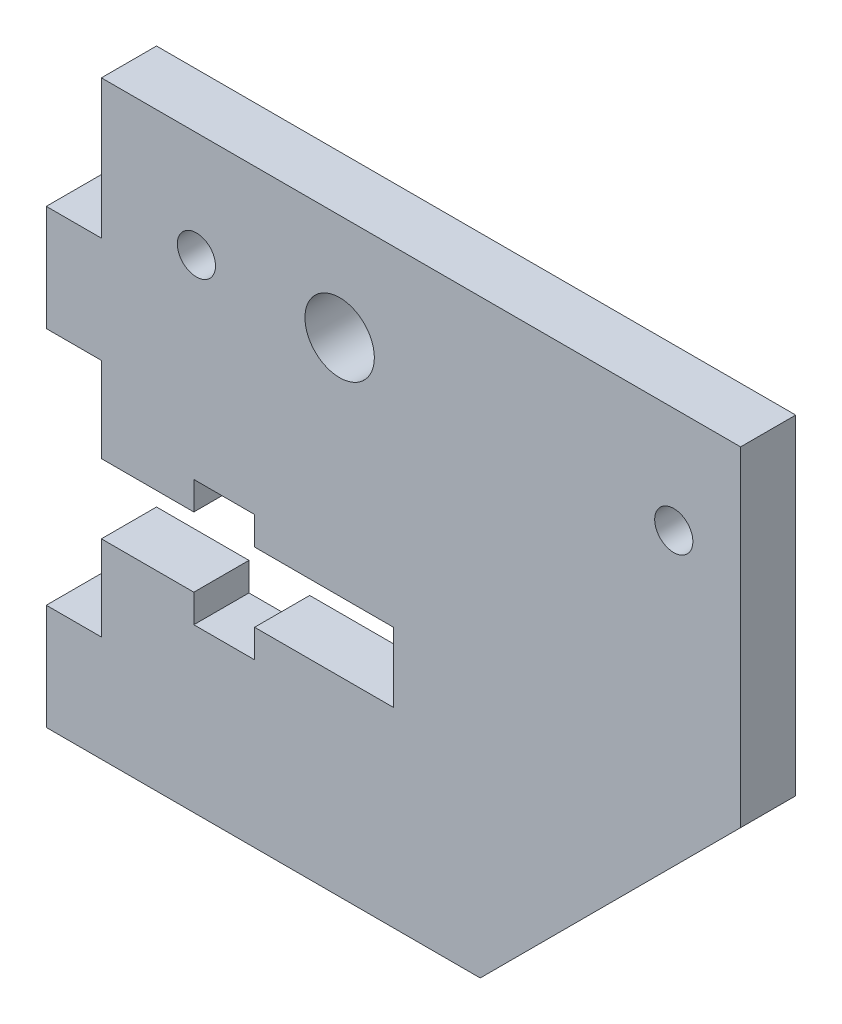
ISO-10303-21;
HEADER;
FILE_DESCRIPTION(('STEP AP214'),'2;1');
FILE_NAME('part.step','',(''),(''),'','','');
FILE_SCHEMA(('AUTOMOTIVE_DESIGN { 1 0 10303 214 1 1 1 1 }'));
ENDSEC;
DATA;
#1=APPLICATION_CONTEXT('core data for automotive mechanical design processes');
#2=APPLICATION_PROTOCOL_DEFINITION('international standard','automotive_design',2000,#1);
#3=PRODUCT_CONTEXT('',#1,'mechanical');
#4=PRODUCT('Part','Part','',(#3));
#5=PRODUCT_RELATED_PRODUCT_CATEGORY('part','',(#4));
#6=PRODUCT_DEFINITION_FORMATION('','',#4);
#7=PRODUCT_DEFINITION_CONTEXT('part definition',#1,'design');
#8=PRODUCT_DEFINITION('design','',#6,#7);
#9=PRODUCT_DEFINITION_SHAPE('','',#8);
#10=(LENGTH_UNIT() NAMED_UNIT(*) SI_UNIT(.MILLI.,.METRE.));
#11=(NAMED_UNIT(*) PLANE_ANGLE_UNIT() SI_UNIT($,.RADIAN.));
#12=(NAMED_UNIT(*) SI_UNIT($,.STERADIAN.) SOLID_ANGLE_UNIT());
#13=UNCERTAINTY_MEASURE_WITH_UNIT(LENGTH_MEASURE(1.E-05),#10,'distance_accuracy_value','');
#14=(GEOMETRIC_REPRESENTATION_CONTEXT(3) GLOBAL_UNCERTAINTY_ASSIGNED_CONTEXT((#13)) GLOBAL_UNIT_ASSIGNED_CONTEXT((#10,
#11,#12)) REPRESENTATION_CONTEXT('',''));
#15=CARTESIAN_POINT('',(0.,0.,0.));
#16=DIRECTION('',(0.,0.,1.));
#17=DIRECTION('',(1.,0.,0.));
#18=AXIS2_PLACEMENT_3D('',#15,#16,#17);
#19=CARTESIAN_POINT('',(0.,34.,3.175));
#20=DIRECTION('',(0.,1.,0.));
#21=DIRECTION('',(-1.,0.,0.));
#22=AXIS2_PLACEMENT_3D('',#19,#20,#21);
#23=PLANE('',#22);
#24=DIRECTION('',(1.,0.,0.));
#25=VECTOR('',#24,1.);
#26=CARTESIAN_POINT('',(0.,34.,0.));
#27=LINE('',#26,#25);
#28=CARTESIAN_POINT('',(3.175,34.,0.));
#29=VERTEX_POINT('',#28);
#30=CARTESIAN_POINT('',(40.,34.,0.));
#31=VERTEX_POINT('',#30);
#32=EDGE_CURVE('E195',#29,#31,#27,.T.);
#33=ORIENTED_EDGE('',*,*,#32,.F.);
#34=DIRECTION('',(0.,0.,-1.));
#35=VECTOR('',#34,1.);
#36=CARTESIAN_POINT('',(3.175,34.,3.175));
#37=LINE('',#36,#35);
#38=CARTESIAN_POINT('',(3.175,34.,3.175));
#39=VERTEX_POINT('',#38);
#40=EDGE_CURVE('E190',#39,#29,#37,.T.);
#41=ORIENTED_EDGE('',*,*,#40,.F.);
#42=DIRECTION('',(1.,0.,0.));
#43=VECTOR('',#42,1.);
#44=CARTESIAN_POINT('',(0.,34.,3.175));
#45=LINE('',#44,#43);
#46=CARTESIAN_POINT('',(40.,34.,3.175));
#47=VERTEX_POINT('',#46);
#48=EDGE_CURVE('E193',#39,#47,#45,.T.);
#49=ORIENTED_EDGE('',*,*,#48,.T.);
#50=DIRECTION('',(0.,0.,-1.));
#51=VECTOR('',#50,1.);
#52=CARTESIAN_POINT('',(40.,34.,3.175));
#53=LINE('',#52,#51);
#54=EDGE_CURVE('E274',#47,#31,#53,.T.);
#55=ORIENTED_EDGE('',*,*,#54,.T.);
#56=EDGE_LOOP('',(#33,#41,#49,#55));
#57=FACE_BOUND('',#56,.T.);
#58=ADVANCED_FACE('F35',(#57),#23,.T.);
#59=CARTESIAN_POINT('',(3.175,0.,3.175));
#60=DIRECTION('',(-1.,0.,0.));
#61=DIRECTION('',(0.,0.,1.));
#62=AXIS2_PLACEMENT_3D('',#59,#60,#61);
#63=PLANE('',#62);
#64=DIRECTION('',(0.,1.,0.));
#65=VECTOR('',#64,1.);
#66=CARTESIAN_POINT('',(3.175,0.,0.));
#67=LINE('',#66,#65);
#68=CARTESIAN_POINT('',(3.175,26.,0.));
#69=VERTEX_POINT('',#68);
#70=EDGE_CURVE('E276',#69,#29,#67,.T.);
#71=ORIENTED_EDGE('',*,*,#70,.F.);
#72=DIRECTION('',(0.,0.,-1.));
#73=VECTOR('',#72,1.);
#74=CARTESIAN_POINT('',(3.175,26.,3.175));
#75=LINE('',#74,#73);
#76=CARTESIAN_POINT('',(3.175,26.,3.175));
#77=VERTEX_POINT('',#76);
#78=EDGE_CURVE('E201',#77,#69,#75,.T.);
#79=ORIENTED_EDGE('',*,*,#78,.F.);
#80=DIRECTION('',(0.,1.,0.));
#81=VECTOR('',#80,1.);
#82=CARTESIAN_POINT('',(3.175,0.,3.175));
#83=LINE('',#82,#81);
#84=EDGE_CURVE('E208',#77,#39,#83,.T.);
#85=ORIENTED_EDGE('',*,*,#84,.T.);
#86=ORIENTED_EDGE('',*,*,#40,.T.);
#87=EDGE_LOOP('',(#71,#79,#85,#86));
#88=FACE_BOUND('',#87,.T.);
#89=ADVANCED_FACE('F215',(#88),#63,.T.);
#90=CARTESIAN_POINT('',(0.,26.,3.175));
#91=DIRECTION('',(0.,1.,0.));
#92=DIRECTION('',(0.,0.,1.));
#93=AXIS2_PLACEMENT_3D('',#90,#91,#92);
#94=PLANE('',#93);
#95=DIRECTION('',(1.,0.,0.));
#96=VECTOR('',#95,1.);
#97=CARTESIAN_POINT('',(0.,26.,0.));
#98=LINE('',#97,#96);
#99=CARTESIAN_POINT('',(0.,26.,0.));
#100=VERTEX_POINT('',#99);
#101=EDGE_CURVE('E278',#100,#69,#98,.T.);
#102=ORIENTED_EDGE('',*,*,#101,.F.);
#103=DIRECTION('',(0.,0.,-1.));
#104=VECTOR('',#103,1.);
#105=CARTESIAN_POINT('',(0.,26.,3.175));
#106=LINE('',#105,#104);
#107=CARTESIAN_POINT('',(0.,26.,3.175));
#108=VERTEX_POINT('',#107);
#109=EDGE_CURVE('E379',#108,#100,#106,.T.);
#110=ORIENTED_EDGE('',*,*,#109,.F.);
#111=DIRECTION('',(1.,0.,0.));
#112=VECTOR('',#111,1.);
#113=CARTESIAN_POINT('',(0.,26.,3.175));
#114=LINE('',#113,#112);
#115=EDGE_CURVE('E216',#108,#77,#114,.T.);
#116=ORIENTED_EDGE('',*,*,#115,.T.);
#117=ORIENTED_EDGE('',*,*,#78,.T.);
#118=EDGE_LOOP('',(#102,#110,#116,#117));
#119=FACE_BOUND('',#118,.T.);
#120=ADVANCED_FACE('F395',(#119),#94,.T.);
#121=CARTESIAN_POINT('',(0.,0.,3.175));
#122=DIRECTION('',(-1.,0.,0.));
#123=DIRECTION('',(0.,-1.,0.));
#124=AXIS2_PLACEMENT_3D('',#121,#122,#123);
#125=PLANE('',#124);
#126=DIRECTION('',(0.,1.,0.));
#127=VECTOR('',#126,1.);
#128=CARTESIAN_POINT('',(0.,0.,0.));
#129=LINE('',#128,#127);
#130=CARTESIAN_POINT('',(0.,19.9,0.));
#131=VERTEX_POINT('',#130);
#132=EDGE_CURVE('E281',#131,#100,#129,.T.);
#133=ORIENTED_EDGE('',*,*,#132,.F.);
#134=DIRECTION('',(0.,0.,-1.));
#135=VECTOR('',#134,1.);
#136=CARTESIAN_POINT('',(0.,19.9,3.175));
#137=LINE('',#136,#135);
#138=CARTESIAN_POINT('',(0.,19.9,3.175));
#139=VERTEX_POINT('',#138);
#140=EDGE_CURVE('E377',#139,#131,#137,.T.);
#141=ORIENTED_EDGE('',*,*,#140,.F.);
#142=DIRECTION('',(0.,1.,0.));
#143=VECTOR('',#142,1.);
#144=CARTESIAN_POINT('',(0.,0.,3.175));
#145=LINE('',#144,#143);
#146=EDGE_CURVE('E218',#139,#108,#145,.T.);
#147=ORIENTED_EDGE('',*,*,#146,.T.);
#148=ORIENTED_EDGE('',*,*,#109,.T.);
#149=EDGE_LOOP('',(#133,#141,#147,#148));
#150=FACE_BOUND('',#149,.T.);
#151=ADVANCED_FACE('F398',(#150),#125,.T.);
#152=CARTESIAN_POINT('',(0.,19.9,3.175));
#153=DIRECTION('',(0.,1.,0.));
#154=DIRECTION('',(0.,0.,1.));
#155=AXIS2_PLACEMENT_3D('',#152,#153,#154);
#156=PLANE('',#155);
#157=DIRECTION('',(1.,0.,0.));
#158=VECTOR('',#157,1.);
#159=CARTESIAN_POINT('',(0.,19.9,0.));
#160=LINE('',#159,#158);
#161=CARTESIAN_POINT('',(3.175,19.9,0.));
#162=VERTEX_POINT('',#161);
#163=EDGE_CURVE('E284',#131,#162,#160,.T.);
#164=ORIENTED_EDGE('',*,*,#163,.T.);
#165=DIRECTION('',(0.,0.,-1.));
#166=VECTOR('',#165,1.);
#167=CARTESIAN_POINT('',(3.175,19.9,3.175));
#168=LINE('',#167,#166);
#169=CARTESIAN_POINT('',(3.175,19.9,3.175));
#170=VERTEX_POINT('',#169);
#171=EDGE_CURVE('E374',#170,#162,#168,.T.);
#172=ORIENTED_EDGE('',*,*,#171,.F.);
#173=DIRECTION('',(1.,0.,0.));
#174=VECTOR('',#173,1.);
#175=CARTESIAN_POINT('',(0.,19.9,3.175));
#176=LINE('',#175,#174);
#177=EDGE_CURVE('E223',#139,#170,#176,.T.);
#178=ORIENTED_EDGE('',*,*,#177,.F.);
#179=ORIENTED_EDGE('',*,*,#140,.T.);
#180=EDGE_LOOP('',(#164,#172,#178,#179));
#181=FACE_BOUND('',#180,.T.);
#182=ADVANCED_FACE('F402',(#181),#156,.F.);
#183=CARTESIAN_POINT('',(3.175,0.,3.175));
#184=DIRECTION('',(1.,0.,0.));
#185=DIRECTION('',(0.,1.,0.));
#186=AXIS2_PLACEMENT_3D('',#183,#184,#185);
#187=PLANE('',#186);
#188=DIRECTION('',(0.,-1.,0.));
#189=VECTOR('',#188,1.);
#190=CARTESIAN_POINT('',(3.175,0.,0.));
#191=LINE('',#190,#189);
#192=CARTESIAN_POINT('',(3.175,15.,0.));
#193=VERTEX_POINT('',#192);
#194=EDGE_CURVE('E286',#162,#193,#191,.T.);
#195=ORIENTED_EDGE('',*,*,#194,.T.);
#196=DIRECTION('',(0.,0.,-1.));
#197=VECTOR('',#196,1.);
#198=CARTESIAN_POINT('',(3.175,15.,3.175));
#199=LINE('',#198,#197);
#200=CARTESIAN_POINT('',(3.175,15.,3.175));
#201=VERTEX_POINT('',#200);
#202=EDGE_CURVE('E371',#201,#193,#199,.T.);
#203=ORIENTED_EDGE('',*,*,#202,.F.);
#204=DIRECTION('',(0.,-1.,0.));
#205=VECTOR('',#204,1.);
#206=CARTESIAN_POINT('',(3.175,0.,3.175));
#207=LINE('',#206,#205);
#208=EDGE_CURVE('E225',#170,#201,#207,.T.);
#209=ORIENTED_EDGE('',*,*,#208,.F.);
#210=ORIENTED_EDGE('',*,*,#171,.T.);
#211=EDGE_LOOP('',(#195,#203,#209,#210));
#212=FACE_BOUND('',#211,.T.);
#213=ADVANCED_FACE('F409',(#212),#187,.F.);
#214=CARTESIAN_POINT('',(0.,15.,3.175));
#215=DIRECTION('',(0.,1.,0.));
#216=DIRECTION('',(0.,0.,1.));
#217=AXIS2_PLACEMENT_3D('',#214,#215,#216);
#218=PLANE('',#217);
#219=DIRECTION('',(1.,0.,0.));
#220=VECTOR('',#219,1.);
#221=CARTESIAN_POINT('',(0.,15.,0.));
#222=LINE('',#221,#220);
#223=CARTESIAN_POINT('',(8.5,15.,0.));
#224=VERTEX_POINT('',#223);
#225=EDGE_CURVE('E288',#193,#224,#222,.T.);
#226=ORIENTED_EDGE('',*,*,#225,.T.);
#227=DIRECTION('',(0.,0.,-1.));
#228=VECTOR('',#227,1.);
#229=CARTESIAN_POINT('',(8.5,15.,3.175));
#230=LINE('',#229,#228);
#231=CARTESIAN_POINT('',(8.5,15.,3.175));
#232=VERTEX_POINT('',#231);
#233=EDGE_CURVE('E369',#232,#224,#230,.T.);
#234=ORIENTED_EDGE('',*,*,#233,.F.);
#235=DIRECTION('',(1.,0.,0.));
#236=VECTOR('',#235,1.);
#237=CARTESIAN_POINT('',(0.,15.,3.175));
#238=LINE('',#237,#236);
#239=EDGE_CURVE('E227',#201,#232,#238,.T.);
#240=ORIENTED_EDGE('',*,*,#239,.F.);
#241=ORIENTED_EDGE('',*,*,#202,.T.);
#242=EDGE_LOOP('',(#226,#234,#240,#241));
#243=FACE_BOUND('',#242,.T.);
#244=ADVANCED_FACE('F413',(#243),#218,.F.);
#245=CARTESIAN_POINT('',(8.5,0.,3.175));
#246=DIRECTION('',(1.,0.,0.));
#247=DIRECTION('',(0.,0.,-1.));
#248=AXIS2_PLACEMENT_3D('',#245,#246,#247);
#249=PLANE('',#248);
#250=DIRECTION('',(0.,-1.,0.));
#251=VECTOR('',#250,1.);
#252=CARTESIAN_POINT('',(8.5,0.,0.));
#253=LINE('',#252,#251);
#254=CARTESIAN_POINT('',(8.5,16.625,0.));
#255=VERTEX_POINT('',#254);
#256=EDGE_CURVE('E291',#255,#224,#253,.T.);
#257=ORIENTED_EDGE('',*,*,#256,.F.);
#258=DIRECTION('',(0.,0.,-1.));
#259=VECTOR('',#258,1.);
#260=CARTESIAN_POINT('',(8.5,16.625,3.175));
#261=LINE('',#260,#259);
#262=CARTESIAN_POINT('',(8.5,16.625,3.175));
#263=VERTEX_POINT('',#262);
#264=EDGE_CURVE('E367',#263,#255,#261,.T.);
#265=ORIENTED_EDGE('',*,*,#264,.F.);
#266=DIRECTION('',(0.,-1.,0.));
#267=VECTOR('',#266,1.);
#268=CARTESIAN_POINT('',(8.5,0.,3.175));
#269=LINE('',#268,#267);
#270=EDGE_CURVE('E229',#263,#232,#269,.T.);
#271=ORIENTED_EDGE('',*,*,#270,.T.);
#272=ORIENTED_EDGE('',*,*,#233,.T.);
#273=EDGE_LOOP('',(#257,#265,#271,#272));
#274=FACE_BOUND('',#273,.T.);
#275=ADVANCED_FACE('F416',(#274),#249,.T.);
#276=CARTESIAN_POINT('',(0.,16.625,3.175));
#277=DIRECTION('',(0.,1.,0.));
#278=DIRECTION('',(0.,0.,1.));
#279=AXIS2_PLACEMENT_3D('',#276,#277,#278);
#280=PLANE('',#279);
#281=DIRECTION('',(1.,0.,0.));
#282=VECTOR('',#281,1.);
#283=CARTESIAN_POINT('',(0.,16.625,0.));
#284=LINE('',#283,#282);
#285=CARTESIAN_POINT('',(12.,16.625,0.));
#286=VERTEX_POINT('',#285);
#287=EDGE_CURVE('E294',#255,#286,#284,.T.);
#288=ORIENTED_EDGE('',*,*,#287,.T.);
#289=DIRECTION('',(0.,0.,-1.));
#290=VECTOR('',#289,1.);
#291=CARTESIAN_POINT('',(12.,16.625,3.175));
#292=LINE('',#291,#290);
#293=CARTESIAN_POINT('',(12.,16.625,3.175));
#294=VERTEX_POINT('',#293);
#295=EDGE_CURVE('E364',#294,#286,#292,.T.);
#296=ORIENTED_EDGE('',*,*,#295,.F.);
#297=DIRECTION('',(1.,0.,0.));
#298=VECTOR('',#297,1.);
#299=CARTESIAN_POINT('',(0.,16.625,3.175));
#300=LINE('',#299,#298);
#301=EDGE_CURVE('E232',#263,#294,#300,.T.);
#302=ORIENTED_EDGE('',*,*,#301,.F.);
#303=ORIENTED_EDGE('',*,*,#264,.T.);
#304=EDGE_LOOP('',(#288,#296,#302,#303));
#305=FACE_BOUND('',#304,.T.);
#306=ADVANCED_FACE('F422',(#305),#280,.F.);
#307=CARTESIAN_POINT('',(12.,0.,3.175));
#308=DIRECTION('',(1.,0.,0.));
#309=DIRECTION('',(0.,0.,-1.));
#310=AXIS2_PLACEMENT_3D('',#307,#308,#309);
#311=PLANE('',#310);
#312=DIRECTION('',(0.,-1.,0.));
#313=VECTOR('',#312,1.);
#314=CARTESIAN_POINT('',(12.,0.,0.));
#315=LINE('',#314,#313);
#316=CARTESIAN_POINT('',(12.,15.,0.));
#317=VERTEX_POINT('',#316);
#318=EDGE_CURVE('E296',#286,#317,#315,.T.);
#319=ORIENTED_EDGE('',*,*,#318,.T.);
#320=DIRECTION('',(0.,0.,-1.));
#321=VECTOR('',#320,1.);
#322=CARTESIAN_POINT('',(12.,15.,3.175));
#323=LINE('',#322,#321);
#324=CARTESIAN_POINT('',(12.,15.,3.175));
#325=VERTEX_POINT('',#324);
#326=EDGE_CURVE('E361',#325,#317,#323,.T.);
#327=ORIENTED_EDGE('',*,*,#326,.F.);
#328=DIRECTION('',(0.,-1.,0.));
#329=VECTOR('',#328,1.);
#330=CARTESIAN_POINT('',(12.,0.,3.175));
#331=LINE('',#330,#329);
#332=EDGE_CURVE('E234',#294,#325,#331,.T.);
#333=ORIENTED_EDGE('',*,*,#332,.F.);
#334=ORIENTED_EDGE('',*,*,#295,.T.);
#335=EDGE_LOOP('',(#319,#327,#333,#334));
#336=FACE_BOUND('',#335,.T.);
#337=ADVANCED_FACE('F426',(#336),#311,.F.);
#338=CARTESIAN_POINT('',(0.,15.,3.175));
#339=DIRECTION('',(0.,1.,0.));
#340=DIRECTION('',(0.,0.,1.));
#341=AXIS2_PLACEMENT_3D('',#338,#339,#340);
#342=PLANE('',#341);
#343=DIRECTION('',(1.,0.,0.));
#344=VECTOR('',#343,1.);
#345=CARTESIAN_POINT('',(0.,15.,0.));
#346=LINE('',#345,#344);
#347=CARTESIAN_POINT('',(20.,15.,0.));
#348=VERTEX_POINT('',#347);
#349=EDGE_CURVE('E298',#317,#348,#346,.T.);
#350=ORIENTED_EDGE('',*,*,#349,.T.);
#351=DIRECTION('',(0.,0.,-1.));
#352=VECTOR('',#351,1.);
#353=CARTESIAN_POINT('',(20.,15.,3.175));
#354=LINE('',#353,#352);
#355=CARTESIAN_POINT('',(20.,15.,3.175));
#356=VERTEX_POINT('',#355);
#357=EDGE_CURVE('E358',#356,#348,#354,.T.);
#358=ORIENTED_EDGE('',*,*,#357,.F.);
#359=DIRECTION('',(1.,0.,0.));
#360=VECTOR('',#359,1.);
#361=CARTESIAN_POINT('',(0.,15.,3.175));
#362=LINE('',#361,#360);
#363=EDGE_CURVE('E236',#325,#356,#362,.T.);
#364=ORIENTED_EDGE('',*,*,#363,.F.);
#365=ORIENTED_EDGE('',*,*,#326,.T.);
#366=EDGE_LOOP('',(#350,#358,#364,#365));
#367=FACE_BOUND('',#366,.T.);
#368=ADVANCED_FACE('F431',(#367),#342,.F.);
#369=CARTESIAN_POINT('',(20.,0.,3.175));
#370=DIRECTION('',(1.,0.,0.));
#371=DIRECTION('',(0.,0.,-1.));
#372=AXIS2_PLACEMENT_3D('',#369,#370,#371);
#373=PLANE('',#372);
#374=DIRECTION('',(0.,-1.,0.));
#375=VECTOR('',#374,1.);
#376=CARTESIAN_POINT('',(20.,0.,0.));
#377=LINE('',#376,#375);
#378=CARTESIAN_POINT('',(20.,11.,0.));
#379=VERTEX_POINT('',#378);
#380=EDGE_CURVE('E300',#348,#379,#377,.T.);
#381=ORIENTED_EDGE('',*,*,#380,.T.);
#382=DIRECTION('',(0.,0.,-1.));
#383=VECTOR('',#382,1.);
#384=CARTESIAN_POINT('',(20.,11.,3.175));
#385=LINE('',#384,#383);
#386=CARTESIAN_POINT('',(20.,11.,3.175));
#387=VERTEX_POINT('',#386);
#388=EDGE_CURVE('E356',#387,#379,#385,.T.);
#389=ORIENTED_EDGE('',*,*,#388,.F.);
#390=DIRECTION('',(0.,-1.,0.));
#391=VECTOR('',#390,1.);
#392=CARTESIAN_POINT('',(20.,0.,3.175));
#393=LINE('',#392,#391);
#394=EDGE_CURVE('E238',#356,#387,#393,.T.);
#395=ORIENTED_EDGE('',*,*,#394,.F.);
#396=ORIENTED_EDGE('',*,*,#357,.T.);
#397=EDGE_LOOP('',(#381,#389,#395,#396));
#398=FACE_BOUND('',#397,.T.);
#399=ADVANCED_FACE('F436',(#398),#373,.F.);
#400=CARTESIAN_POINT('',(0.,11.,3.175));
#401=DIRECTION('',(0.,1.,0.));
#402=DIRECTION('',(0.,0.,1.));
#403=AXIS2_PLACEMENT_3D('',#400,#401,#402);
#404=PLANE('',#403);
#405=DIRECTION('',(1.,0.,0.));
#406=VECTOR('',#405,1.);
#407=CARTESIAN_POINT('',(0.,11.,0.));
#408=LINE('',#407,#406);
#409=CARTESIAN_POINT('',(12.,11.,0.));
#410=VERTEX_POINT('',#409);
#411=EDGE_CURVE('E303',#410,#379,#408,.T.);
#412=ORIENTED_EDGE('',*,*,#411,.F.);
#413=DIRECTION('',(0.,0.,-1.));
#414=VECTOR('',#413,1.);
#415=CARTESIAN_POINT('',(12.,11.,3.175));
#416=LINE('',#415,#414);
#417=CARTESIAN_POINT('',(12.,11.,3.175));
#418=VERTEX_POINT('',#417);
#419=EDGE_CURVE('E354',#418,#410,#416,.T.);
#420=ORIENTED_EDGE('',*,*,#419,.F.);
#421=DIRECTION('',(1.,0.,0.));
#422=VECTOR('',#421,1.);
#423=CARTESIAN_POINT('',(0.,11.,3.175));
#424=LINE('',#423,#422);
#425=EDGE_CURVE('E240',#418,#387,#424,.T.);
#426=ORIENTED_EDGE('',*,*,#425,.T.);
#427=ORIENTED_EDGE('',*,*,#388,.T.);
#428=EDGE_LOOP('',(#412,#420,#426,#427));
#429=FACE_BOUND('',#428,.T.);
#430=ADVANCED_FACE('F440',(#429),#404,.T.);
#431=CARTESIAN_POINT('',(12.,0.,3.175));
#432=DIRECTION('',(1.,0.,0.));
#433=DIRECTION('',(0.,0.,-1.));
#434=AXIS2_PLACEMENT_3D('',#431,#432,#433);
#435=PLANE('',#434);
#436=DIRECTION('',(0.,-1.,0.));
#437=VECTOR('',#436,1.);
#438=CARTESIAN_POINT('',(12.,0.,0.));
#439=LINE('',#438,#437);
#440=CARTESIAN_POINT('',(12.,9.375,0.));
#441=VERTEX_POINT('',#440);
#442=EDGE_CURVE('E306',#410,#441,#439,.T.);
#443=ORIENTED_EDGE('',*,*,#442,.T.);
#444=DIRECTION('',(0.,0.,-1.));
#445=VECTOR('',#444,1.);
#446=CARTESIAN_POINT('',(12.,9.375,3.175));
#447=LINE('',#446,#445);
#448=CARTESIAN_POINT('',(12.,9.375,3.175));
#449=VERTEX_POINT('',#448);
#450=EDGE_CURVE('E352',#449,#441,#447,.T.);
#451=ORIENTED_EDGE('',*,*,#450,.F.);
#452=DIRECTION('',(0.,-1.,0.));
#453=VECTOR('',#452,1.);
#454=CARTESIAN_POINT('',(12.,0.,3.175));
#455=LINE('',#454,#453);
#456=EDGE_CURVE('E243',#418,#449,#455,.T.);
#457=ORIENTED_EDGE('',*,*,#456,.F.);
#458=ORIENTED_EDGE('',*,*,#419,.T.);
#459=EDGE_LOOP('',(#443,#451,#457,#458));
#460=FACE_BOUND('',#459,.T.);
#461=ADVANCED_FACE('F445',(#460),#435,.F.);
#462=CARTESIAN_POINT('',(0.,9.375,3.175));
#463=DIRECTION('',(0.,1.,0.));
#464=DIRECTION('',(0.,0.,1.));
#465=AXIS2_PLACEMENT_3D('',#462,#463,#464);
#466=PLANE('',#465);
#467=DIRECTION('',(1.,0.,0.));
#468=VECTOR('',#467,1.);
#469=CARTESIAN_POINT('',(0.,9.375,0.));
#470=LINE('',#469,#468);
#471=CARTESIAN_POINT('',(8.5,9.375,0.));
#472=VERTEX_POINT('',#471);
#473=EDGE_CURVE('E309',#472,#441,#470,.T.);
#474=ORIENTED_EDGE('',*,*,#473,.F.);
#475=DIRECTION('',(0.,0.,-1.));
#476=VECTOR('',#475,1.);
#477=CARTESIAN_POINT('',(8.5,9.375,3.175));
#478=LINE('',#477,#476);
#479=CARTESIAN_POINT('',(8.5,9.375,3.175));
#480=VERTEX_POINT('',#479);
#481=EDGE_CURVE('E350',#480,#472,#478,.T.);
#482=ORIENTED_EDGE('',*,*,#481,.F.);
#483=DIRECTION('',(1.,0.,0.));
#484=VECTOR('',#483,1.);
#485=CARTESIAN_POINT('',(0.,9.375,3.175));
#486=LINE('',#485,#484);
#487=EDGE_CURVE('E245',#480,#449,#486,.T.);
#488=ORIENTED_EDGE('',*,*,#487,.T.);
#489=ORIENTED_EDGE('',*,*,#450,.T.);
#490=EDGE_LOOP('',(#474,#482,#488,#489));
#491=FACE_BOUND('',#490,.T.);
#492=ADVANCED_FACE('F505',(#491),#466,.T.);
#493=CARTESIAN_POINT('',(8.5,0.,3.175));
#494=DIRECTION('',(1.,0.,0.));
#495=DIRECTION('',(0.,0.,-1.));
#496=AXIS2_PLACEMENT_3D('',#493,#494,#495);
#497=PLANE('',#496);
#498=DIRECTION('',(0.,-1.,0.));
#499=VECTOR('',#498,1.);
#500=CARTESIAN_POINT('',(8.5,0.,0.));
#501=LINE('',#500,#499);
#502=CARTESIAN_POINT('',(8.5,11.,0.));
#503=VERTEX_POINT('',#502);
#504=EDGE_CURVE('E312',#503,#472,#501,.T.);
#505=ORIENTED_EDGE('',*,*,#504,.F.);
#506=DIRECTION('',(0.,0.,-1.));
#507=VECTOR('',#506,1.);
#508=CARTESIAN_POINT('',(8.5,11.,3.175));
#509=LINE('',#508,#507);
#510=CARTESIAN_POINT('',(8.5,11.,3.175));
#511=VERTEX_POINT('',#510);
#512=EDGE_CURVE('E348',#511,#503,#509,.T.);
#513=ORIENTED_EDGE('',*,*,#512,.F.);
#514=DIRECTION('',(0.,-1.,0.));
#515=VECTOR('',#514,1.);
#516=CARTESIAN_POINT('',(8.5,0.,3.175));
#517=LINE('',#516,#515);
#518=EDGE_CURVE('E248',#511,#480,#517,.T.);
#519=ORIENTED_EDGE('',*,*,#518,.T.);
#520=ORIENTED_EDGE('',*,*,#481,.T.);
#521=EDGE_LOOP('',(#505,#513,#519,#520));
#522=FACE_BOUND('',#521,.T.);
#523=ADVANCED_FACE('F452',(#522),#497,.T.);
#524=CARTESIAN_POINT('',(0.,11.,3.175));
#525=DIRECTION('',(0.,1.,0.));
#526=DIRECTION('',(0.,0.,1.));
#527=AXIS2_PLACEMENT_3D('',#524,#525,#526);
#528=PLANE('',#527);
#529=DIRECTION('',(1.,0.,0.));
#530=VECTOR('',#529,1.);
#531=CARTESIAN_POINT('',(0.,11.,0.));
#532=LINE('',#531,#530);
#533=CARTESIAN_POINT('',(3.175,11.,0.));
#534=VERTEX_POINT('',#533);
#535=EDGE_CURVE('E315',#534,#503,#532,.T.);
#536=ORIENTED_EDGE('',*,*,#535,.F.);
#537=DIRECTION('',(0.,0.,-1.));
#538=VECTOR('',#537,1.);
#539=CARTESIAN_POINT('',(3.175,11.,3.175));
#540=LINE('',#539,#538);
#541=CARTESIAN_POINT('',(3.175,11.,3.175));
#542=VERTEX_POINT('',#541);
#543=EDGE_CURVE('E346',#542,#534,#540,.T.);
#544=ORIENTED_EDGE('',*,*,#543,.F.);
#545=DIRECTION('',(1.,0.,0.));
#546=VECTOR('',#545,1.);
#547=CARTESIAN_POINT('',(0.,11.,3.175));
#548=LINE('',#547,#546);
#549=EDGE_CURVE('E251',#542,#511,#548,.T.);
#550=ORIENTED_EDGE('',*,*,#549,.T.);
#551=ORIENTED_EDGE('',*,*,#512,.T.);
#552=EDGE_LOOP('',(#536,#544,#550,#551));
#553=FACE_BOUND('',#552,.T.);
#554=ADVANCED_FACE('F456',(#553),#528,.T.);
#555=CARTESIAN_POINT('',(3.175,0.,3.175));
#556=DIRECTION('',(1.,0.,0.));
#557=DIRECTION('',(0.,1.,0.));
#558=AXIS2_PLACEMENT_3D('',#555,#556,#557);
#559=PLANE('',#558);
#560=DIRECTION('',(0.,-1.,0.));
#561=VECTOR('',#560,1.);
#562=CARTESIAN_POINT('',(3.175,0.,0.));
#563=LINE('',#562,#561);
#564=CARTESIAN_POINT('',(3.175,6.1,0.));
#565=VERTEX_POINT('',#564);
#566=EDGE_CURVE('E318',#534,#565,#563,.T.);
#567=ORIENTED_EDGE('',*,*,#566,.T.);
#568=DIRECTION('',(0.,0.,-1.));
#569=VECTOR('',#568,1.);
#570=CARTESIAN_POINT('',(3.175,6.1,3.175));
#571=LINE('',#570,#569);
#572=CARTESIAN_POINT('',(3.175,6.1,3.175));
#573=VERTEX_POINT('',#572);
#574=EDGE_CURVE('E344',#573,#565,#571,.T.);
#575=ORIENTED_EDGE('',*,*,#574,.F.);
#576=DIRECTION('',(0.,-1.,0.));
#577=VECTOR('',#576,1.);
#578=CARTESIAN_POINT('',(3.175,0.,3.175));
#579=LINE('',#578,#577);
#580=EDGE_CURVE('E254',#542,#573,#579,.T.);
#581=ORIENTED_EDGE('',*,*,#580,.F.);
#582=ORIENTED_EDGE('',*,*,#543,.T.);
#583=EDGE_LOOP('',(#567,#575,#581,#582));
#584=FACE_BOUND('',#583,.T.);
#585=ADVANCED_FACE('F462',(#584),#559,.F.);
#586=CARTESIAN_POINT('',(0.,6.1,3.175));
#587=DIRECTION('',(0.,1.,0.));
#588=DIRECTION('',(0.,0.,1.));
#589=AXIS2_PLACEMENT_3D('',#586,#587,#588);
#590=PLANE('',#589);
#591=DIRECTION('',(1.,0.,0.));
#592=VECTOR('',#591,1.);
#593=CARTESIAN_POINT('',(0.,6.1,0.));
#594=LINE('',#593,#592);
#595=CARTESIAN_POINT('',(0.,6.1,0.));
#596=VERTEX_POINT('',#595);
#597=EDGE_CURVE('E321',#596,#565,#594,.T.);
#598=ORIENTED_EDGE('',*,*,#597,.F.);
#599=DIRECTION('',(0.,0.,-1.));
#600=VECTOR('',#599,1.);
#601=CARTESIAN_POINT('',(0.,6.1,3.175));
#602=LINE('',#601,#600);
#603=CARTESIAN_POINT('',(0.,6.1,3.175));
#604=VERTEX_POINT('',#603);
#605=EDGE_CURVE('E342',#604,#596,#602,.T.);
#606=ORIENTED_EDGE('',*,*,#605,.F.);
#607=DIRECTION('',(1.,0.,0.));
#608=VECTOR('',#607,1.);
#609=CARTESIAN_POINT('',(0.,6.1,3.175));
#610=LINE('',#609,#608);
#611=EDGE_CURVE('E256',#604,#573,#610,.T.);
#612=ORIENTED_EDGE('',*,*,#611,.T.);
#613=ORIENTED_EDGE('',*,*,#574,.T.);
#614=EDGE_LOOP('',(#598,#606,#612,#613));
#615=FACE_BOUND('',#614,.T.);
#616=ADVANCED_FACE('F466',(#615),#590,.T.);
#617=CARTESIAN_POINT('',(0.,0.,3.175));
#618=DIRECTION('',(-1.,0.,0.));
#619=DIRECTION('',(0.,-1.,0.));
#620=AXIS2_PLACEMENT_3D('',#617,#618,#619);
#621=PLANE('',#620);
#622=DIRECTION('',(0.,1.,0.));
#623=VECTOR('',#622,1.);
#624=CARTESIAN_POINT('',(0.,0.,0.));
#625=LINE('',#624,#623);
#626=CARTESIAN_POINT('',(0.,0.,0.));
#627=VERTEX_POINT('',#626);
#628=EDGE_CURVE('E324',#627,#596,#625,.T.);
#629=ORIENTED_EDGE('',*,*,#628,.F.);
#630=DIRECTION('',(0.,0.,-1.));
#631=VECTOR('',#630,1.);
#632=CARTESIAN_POINT('',(0.,0.,3.175));
#633=LINE('',#632,#631);
#634=CARTESIAN_POINT('',(0.,0.,3.175));
#635=VERTEX_POINT('',#634);
#636=EDGE_CURVE('E340',#635,#627,#633,.T.);
#637=ORIENTED_EDGE('',*,*,#636,.F.);
#638=DIRECTION('',(0.,1.,0.));
#639=VECTOR('',#638,1.);
#640=CARTESIAN_POINT('',(0.,0.,3.175));
#641=LINE('',#640,#639);
#642=EDGE_CURVE('E259',#635,#604,#641,.T.);
#643=ORIENTED_EDGE('',*,*,#642,.T.);
#644=ORIENTED_EDGE('',*,*,#605,.T.);
#645=EDGE_LOOP('',(#629,#637,#643,#644));
#646=FACE_BOUND('',#645,.T.);
#647=ADVANCED_FACE('F469',(#646),#621,.T.);
#648=CARTESIAN_POINT('',(0.,0.,3.175));
#649=DIRECTION('',(0.,1.,0.));
#650=DIRECTION('',(-1.,0.,0.));
#651=AXIS2_PLACEMENT_3D('',#648,#649,#650);
#652=PLANE('',#651);
#653=DIRECTION('',(1.,0.,0.));
#654=VECTOR('',#653,1.);
#655=CARTESIAN_POINT('',(0.,0.,0.));
#656=LINE('',#655,#654);
#657=CARTESIAN_POINT('',(25.,0.,0.));
#658=VERTEX_POINT('',#657);
#659=EDGE_CURVE('E327',#627,#658,#656,.T.);
#660=ORIENTED_EDGE('',*,*,#659,.T.);
#661=DIRECTION('',(0.,0.,1.));
#662=VECTOR('',#661,1.);
#663=CARTESIAN_POINT('',(25.,0.,3.175));
#664=LINE('',#663,#662);
#665=CARTESIAN_POINT('',(25.,0.,3.175));
#666=VERTEX_POINT('',#665);
#667=EDGE_CURVE('E43',#658,#666,#664,.T.);
#668=ORIENTED_EDGE('',*,*,#667,.T.);
#669=DIRECTION('',(1.,0.,0.));
#670=VECTOR('',#669,1.);
#671=CARTESIAN_POINT('',(0.,0.,3.175));
#672=LINE('',#671,#670);
#673=EDGE_CURVE('E262',#635,#666,#672,.T.);
#674=ORIENTED_EDGE('',*,*,#673,.F.);
#675=ORIENTED_EDGE('',*,*,#636,.T.);
#676=EDGE_LOOP('',(#660,#668,#674,#675));
#677=FACE_BOUND('',#676,.T.);
#678=ADVANCED_FACE('F518',(#677),#652,.F.);
#679=CARTESIAN_POINT('',(36.15,27.9,3.175));
#680=DIRECTION('',(0.,0.,-1.));
#681=DIRECTION('',(-1.,0.,0.));
#682=AXIS2_PLACEMENT_3D('',#679,#680,#681);
#683=CYLINDRICAL_SURFACE('',#682,1.10000000000001);
#684=CARTESIAN_POINT('',(36.15,27.9,3.175));
#685=DIRECTION('',(0.,0.,1.));
#686=DIRECTION('',(1.,0.,0.));
#687=AXIS2_PLACEMENT_3D('',#684,#685,#686);
#688=CIRCLE('',#687,1.10000000000001);
#689=CARTESIAN_POINT('',(37.25,27.9,3.175));
#690=VERTEX_POINT('',#689);
#691=EDGE_CURVE('E268',#690,#690,#688,.T.);
#692=ORIENTED_EDGE('',*,*,#691,.T.);
#693=EDGE_LOOP('',(#692));
#694=FACE_BOUND('',#693,.T.);
#695=CARTESIAN_POINT('',(36.15,27.9,0.));
#696=DIRECTION('',(0.,0.,1.));
#697=DIRECTION('',(1.,0.,0.));
#698=AXIS2_PLACEMENT_3D('',#695,#696,#697);
#699=CIRCLE('',#698,1.10000000000001);
#700=CARTESIAN_POINT('',(37.25,27.9,0.));
#701=VERTEX_POINT('',#700);
#702=EDGE_CURVE('E334',#701,#701,#699,.T.);
#703=ORIENTED_EDGE('',*,*,#702,.F.);
#704=EDGE_LOOP('',(#703));
#705=FACE_BOUND('',#704,.T.);
#706=ADVANCED_FACE('F521',(#694,#705),#683,.F.);
#707=CARTESIAN_POINT('',(8.65,27.9,3.175));
#708=DIRECTION('',(0.,0.,-1.));
#709=DIRECTION('',(-1.,0.,0.));
#710=AXIS2_PLACEMENT_3D('',#707,#708,#709);
#711=CYLINDRICAL_SURFACE('',#710,1.1);
#712=CARTESIAN_POINT('',(8.65,27.9,3.175));
#713=DIRECTION('',(0.,0.,1.));
#714=DIRECTION('',(1.,0.,0.));
#715=AXIS2_PLACEMENT_3D('',#712,#713,#714);
#716=CIRCLE('',#715,1.1);
#717=CARTESIAN_POINT('',(9.75,27.9,3.175));
#718=VERTEX_POINT('',#717);
#719=EDGE_CURVE('E265',#718,#718,#716,.T.);
#720=ORIENTED_EDGE('',*,*,#719,.T.);
#721=EDGE_LOOP('',(#720));
#722=FACE_BOUND('',#721,.T.);
#723=CARTESIAN_POINT('',(8.65,27.9,0.));
#724=DIRECTION('',(0.,0.,1.));
#725=DIRECTION('',(1.,0.,0.));
#726=AXIS2_PLACEMENT_3D('',#723,#724,#725);
#727=CIRCLE('',#726,1.1);
#728=CARTESIAN_POINT('',(9.75,27.9,0.));
#729=VERTEX_POINT('',#728);
#730=EDGE_CURVE('E331',#729,#729,#727,.T.);
#731=ORIENTED_EDGE('',*,*,#730,.F.);
#732=EDGE_LOOP('',(#731));
#733=FACE_BOUND('',#732,.T.);
#734=ADVANCED_FACE('F525',(#722,#733),#711,.F.);
#735=CARTESIAN_POINT('',(40.,0.,3.175));
#736=DIRECTION('',(-1.,0.,0.));
#737=DIRECTION('',(0.,0.,1.));
#738=AXIS2_PLACEMENT_3D('',#735,#736,#737);
#739=PLANE('',#738);
#740=DIRECTION('',(0.,1.,0.));
#741=VECTOR('',#740,1.);
#742=CARTESIAN_POINT('',(40.,0.,3.175));
#743=LINE('',#742,#741);
#744=CARTESIAN_POINT('',(40.,15.,3.175));
#745=VERTEX_POINT('',#744);
#746=EDGE_CURVE('E211',#745,#47,#743,.T.);
#747=ORIENTED_EDGE('',*,*,#746,.F.);
#748=DIRECTION('',(0.,0.,-1.));
#749=VECTOR('',#748,1.);
#750=CARTESIAN_POINT('',(40.,15.,3.175));
#751=LINE('',#750,#749);
#752=CARTESIAN_POINT('',(40.,15.,0.));
#753=VERTEX_POINT('',#752);
#754=EDGE_CURVE('E200',#745,#753,#751,.T.);
#755=ORIENTED_EDGE('',*,*,#754,.T.);
#756=DIRECTION('',(0.,1.,0.));
#757=VECTOR('',#756,1.);
#758=CARTESIAN_POINT('',(40.,0.,0.));
#759=LINE('',#758,#757);
#760=EDGE_CURVE('E329',#753,#31,#759,.T.);
#761=ORIENTED_EDGE('',*,*,#760,.T.);
#762=ORIENTED_EDGE('',*,*,#54,.F.);
#763=EDGE_LOOP('',(#747,#755,#761,#762));
#764=FACE_BOUND('',#763,.T.);
#765=ADVANCED_FACE('F386',(#764),#739,.F.);
#766=CARTESIAN_POINT('',(16.9,27.9,3.175));
#767=DIRECTION('',(0.,0.,-1.));
#768=DIRECTION('',(-1.,0.,0.));
#769=AXIS2_PLACEMENT_3D('',#766,#767,#768);
#770=CYLINDRICAL_SURFACE('',#769,2.);
#771=CARTESIAN_POINT('',(16.9,27.9,3.175));
#772=DIRECTION('',(0.,0.,1.));
#773=DIRECTION('',(1.,0.,0.));
#774=AXIS2_PLACEMENT_3D('',#771,#772,#773);
#775=CIRCLE('',#774,2.);
#776=CARTESIAN_POINT('',(18.9,27.9,3.175));
#777=VERTEX_POINT('',#776);
#778=EDGE_CURVE('E271',#777,#777,#775,.T.);
#779=ORIENTED_EDGE('',*,*,#778,.T.);
#780=EDGE_LOOP('',(#779));
#781=FACE_BOUND('',#780,.T.);
#782=CARTESIAN_POINT('',(16.9,27.9,0.));
#783=DIRECTION('',(0.,0.,1.));
#784=DIRECTION('',(1.,0.,0.));
#785=AXIS2_PLACEMENT_3D('',#782,#783,#784);
#786=CIRCLE('',#785,2.);
#787=CARTESIAN_POINT('',(18.9,27.9,0.));
#788=VERTEX_POINT('',#787);
#789=EDGE_CURVE('E213',#788,#788,#786,.T.);
#790=ORIENTED_EDGE('',*,*,#789,.F.);
#791=EDGE_LOOP('',(#790));
#792=FACE_BOUND('',#791,.T.);
#793=ADVANCED_FACE('F524',(#781,#792),#770,.F.);
#794=CARTESIAN_POINT('',(0.,0.,3.175));
#795=DIRECTION('',(0.,0.,1.));
#796=DIRECTION('',(1.,0.,0.));
#797=AXIS2_PLACEMENT_3D('',#794,#795,#796);
#798=PLANE('',#797);
#799=ORIENTED_EDGE('',*,*,#673,.T.);
#800=DIRECTION('',(-0.707106781186549,-0.707106781186546,0.));
#801=VECTOR('',#800,1.);
#802=CARTESIAN_POINT('',(12.4999999999999,-12.5,3.175));
#803=LINE('',#802,#801);
#804=EDGE_CURVE('E11',#666,#745,#803,.F.);
#805=ORIENTED_EDGE('',*,*,#804,.T.);
#806=ORIENTED_EDGE('',*,*,#746,.T.);
#807=ORIENTED_EDGE('',*,*,#48,.F.);
#808=ORIENTED_EDGE('',*,*,#84,.F.);
#809=ORIENTED_EDGE('',*,*,#115,.F.);
#810=ORIENTED_EDGE('',*,*,#146,.F.);
#811=ORIENTED_EDGE('',*,*,#177,.T.);
#812=ORIENTED_EDGE('',*,*,#208,.T.);
#813=ORIENTED_EDGE('',*,*,#239,.T.);
#814=ORIENTED_EDGE('',*,*,#270,.F.);
#815=ORIENTED_EDGE('',*,*,#301,.T.);
#816=ORIENTED_EDGE('',*,*,#332,.T.);
#817=ORIENTED_EDGE('',*,*,#363,.T.);
#818=ORIENTED_EDGE('',*,*,#394,.T.);
#819=ORIENTED_EDGE('',*,*,#425,.F.);
#820=ORIENTED_EDGE('',*,*,#456,.T.);
#821=ORIENTED_EDGE('',*,*,#487,.F.);
#822=ORIENTED_EDGE('',*,*,#518,.F.);
#823=ORIENTED_EDGE('',*,*,#549,.F.);
#824=ORIENTED_EDGE('',*,*,#580,.T.);
#825=ORIENTED_EDGE('',*,*,#611,.F.);
#826=ORIENTED_EDGE('',*,*,#642,.F.);
#827=EDGE_LOOP('',(#799,#805,#806,#807,#808,#809,#810,#811,#812,#813,#814,#815,#816,#817,#818,
#819,#820,#821,#822,#823,#824,#825,#826));
#828=FACE_BOUND('',#827,.T.);
#829=ORIENTED_EDGE('',*,*,#719,.F.);
#830=EDGE_LOOP('',(#829));
#831=FACE_BOUND('',#830,.T.);
#832=ORIENTED_EDGE('',*,*,#691,.F.);
#833=EDGE_LOOP('',(#832));
#834=FACE_BOUND('',#833,.T.);
#835=ORIENTED_EDGE('',*,*,#778,.F.);
#836=EDGE_LOOP('',(#835));
#837=FACE_BOUND('',#836,.T.);
#838=ADVANCED_FACE('F205',(#828,#831,#834,#837),#798,.T.);
#839=CARTESIAN_POINT('',(0.,0.,0.));
#840=DIRECTION('',(0.,0.,1.));
#841=DIRECTION('',(1.,0.,0.));
#842=AXIS2_PLACEMENT_3D('',#839,#840,#841);
#843=PLANE('',#842);
#844=ORIENTED_EDGE('',*,*,#760,.F.);
#845=DIRECTION('',(0.707106781186549,0.707106781186546,0.));
#846=VECTOR('',#845,1.);
#847=CARTESIAN_POINT('',(40.,15.,0.));
#848=LINE('',#847,#846);
#849=EDGE_CURVE('E57',#753,#658,#848,.F.);
#850=ORIENTED_EDGE('',*,*,#849,.T.);
#851=ORIENTED_EDGE('',*,*,#659,.F.);
#852=ORIENTED_EDGE('',*,*,#628,.T.);
#853=ORIENTED_EDGE('',*,*,#597,.T.);
#854=ORIENTED_EDGE('',*,*,#566,.F.);
#855=ORIENTED_EDGE('',*,*,#535,.T.);
#856=ORIENTED_EDGE('',*,*,#504,.T.);
#857=ORIENTED_EDGE('',*,*,#473,.T.);
#858=ORIENTED_EDGE('',*,*,#442,.F.);
#859=ORIENTED_EDGE('',*,*,#411,.T.);
#860=ORIENTED_EDGE('',*,*,#380,.F.);
#861=ORIENTED_EDGE('',*,*,#349,.F.);
#862=ORIENTED_EDGE('',*,*,#318,.F.);
#863=ORIENTED_EDGE('',*,*,#287,.F.);
#864=ORIENTED_EDGE('',*,*,#256,.T.);
#865=ORIENTED_EDGE('',*,*,#225,.F.);
#866=ORIENTED_EDGE('',*,*,#194,.F.);
#867=ORIENTED_EDGE('',*,*,#163,.F.);
#868=ORIENTED_EDGE('',*,*,#132,.T.);
#869=ORIENTED_EDGE('',*,*,#101,.T.);
#870=ORIENTED_EDGE('',*,*,#70,.T.);
#871=ORIENTED_EDGE('',*,*,#32,.T.);
#872=EDGE_LOOP('',(#844,#850,#851,#852,#853,#854,#855,#856,#857,#858,#859,#860,#861,#862,#863,
#864,#865,#866,#867,#868,#869,#870,#871));
#873=FACE_BOUND('',#872,.T.);
#874=ORIENTED_EDGE('',*,*,#730,.T.);
#875=EDGE_LOOP('',(#874));
#876=FACE_BOUND('',#875,.T.);
#877=ORIENTED_EDGE('',*,*,#702,.T.);
#878=EDGE_LOOP('',(#877));
#879=FACE_BOUND('',#878,.T.);
#880=ORIENTED_EDGE('',*,*,#789,.T.);
#881=EDGE_LOOP('',(#880));
#882=FACE_BOUND('',#881,.T.);
#883=ADVANCED_FACE('F389',(#873,#876,#879,#882),#843,.F.);
#884=CARTESIAN_POINT('',(40.,15.,3.175));
#885=DIRECTION('',(-0.707106781186546,0.707106781186549,0.));
#886=DIRECTION('',(0.,0.,-1.));
#887=AXIS2_PLACEMENT_3D('',#884,#885,#886);
#888=PLANE('',#887);
#889=ORIENTED_EDGE('',*,*,#804,.F.);
#890=ORIENTED_EDGE('',*,*,#667,.F.);
#891=ORIENTED_EDGE('',*,*,#849,.F.);
#892=ORIENTED_EDGE('',*,*,#754,.F.);
#893=EDGE_LOOP('',(#889,#890,#891,#892));
#894=FACE_BOUND('',#893,.T.);
#895=ADVANCED_FACE('F37',(#894),#888,.F.);
#896=CLOSED_SHELL('',(#58,#89,#120,#151,#182,#213,#244,#275,#306,#337,#368,#399,#430,#461,#492,
#523,#554,#585,#616,#647,#678,#706,#734,#765,#793,#838,#883,#895));
#897=MANIFOLD_SOLID_BREP('B2',#896);
#898=ADVANCED_BREP_SHAPE_REPRESENTATION('',(#18,#897),#14);
#899=SHAPE_DEFINITION_REPRESENTATION(#9,#898);
ENDSEC;
END-ISO-10303-21;
